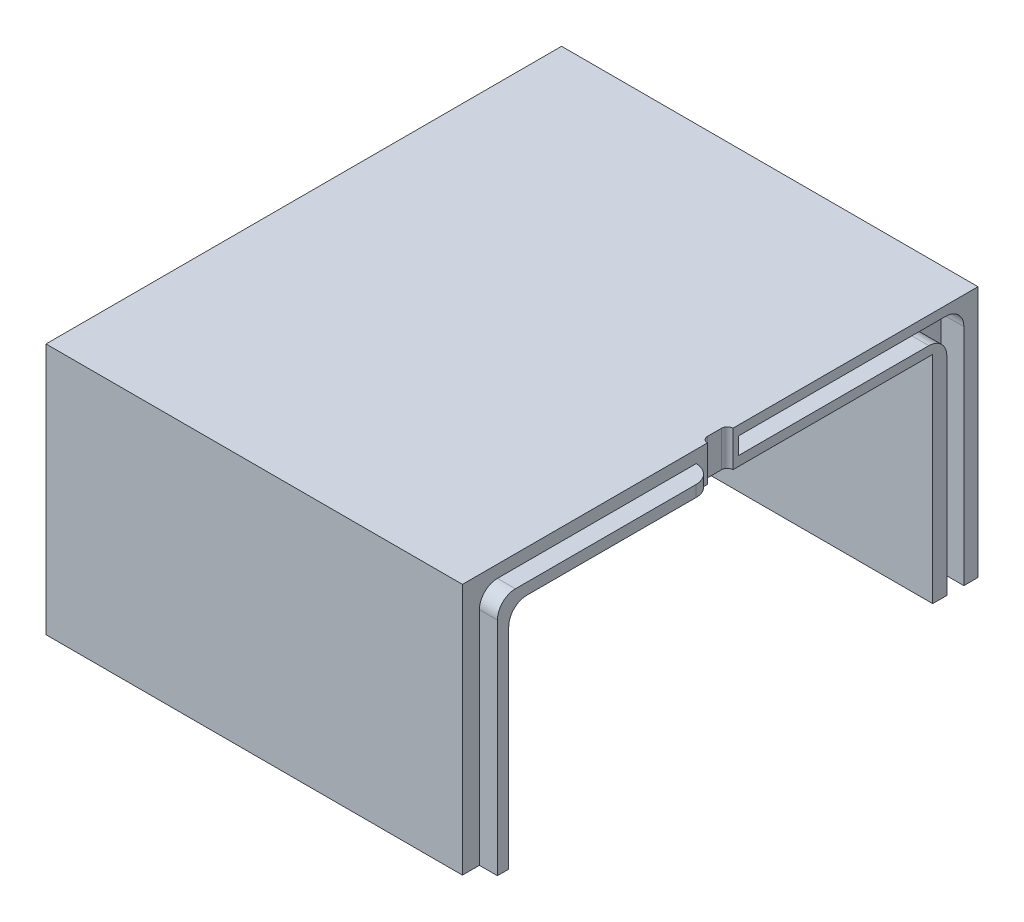
ISO-10303-21;
HEADER;
FILE_DESCRIPTION(('STEP AP214'),'2;1');
FILE_NAME('part.step','',(''),(''),'','','');
FILE_SCHEMA(('AUTOMOTIVE_DESIGN { 1 0 10303 214 1 1 1 1 }'));
ENDSEC;
DATA;
#1=APPLICATION_CONTEXT('core data for automotive mechanical design processes');
#2=APPLICATION_PROTOCOL_DEFINITION('international standard','automotive_design',2000,#1);
#3=PRODUCT_CONTEXT('',#1,'mechanical');
#4=PRODUCT('Part','Part','',(#3));
#5=PRODUCT_RELATED_PRODUCT_CATEGORY('part','',(#4));
#6=PRODUCT_DEFINITION_FORMATION('','',#4);
#7=PRODUCT_DEFINITION_CONTEXT('part definition',#1,'design');
#8=PRODUCT_DEFINITION('design','',#6,#7);
#9=PRODUCT_DEFINITION_SHAPE('','',#8);
#10=(LENGTH_UNIT() NAMED_UNIT(*) SI_UNIT(.MILLI.,.METRE.));
#11=(NAMED_UNIT(*) PLANE_ANGLE_UNIT() SI_UNIT($,.RADIAN.));
#12=(NAMED_UNIT(*) SI_UNIT($,.STERADIAN.) SOLID_ANGLE_UNIT());
#13=UNCERTAINTY_MEASURE_WITH_UNIT(LENGTH_MEASURE(1.E-05),#10,'distance_accuracy_value','');
#14=(GEOMETRIC_REPRESENTATION_CONTEXT(3) GLOBAL_UNCERTAINTY_ASSIGNED_CONTEXT((#13)) GLOBAL_UNIT_ASSIGNED_CONTEXT((#10,
#11,#12)) REPRESENTATION_CONTEXT('',''));
#15=CARTESIAN_POINT('',(0.,0.,0.));
#16=DIRECTION('',(0.,0.,1.));
#17=DIRECTION('',(1.,0.,0.));
#18=AXIS2_PLACEMENT_3D('',#15,#16,#17);
#19=CARTESIAN_POINT('',(0.,19.05,0.));
#20=DIRECTION('',(1.,0.,0.));
#21=DIRECTION('',(0.,0.,-1.));
#22=AXIS2_PLACEMENT_3D('',#19,#20,#21);
#23=PLANE('',#22);
#24=DIRECTION('',(0.,-1.,0.));
#25=VECTOR('',#24,1.);
#26=CARTESIAN_POINT('',(0.,0.,2.75));
#27=LINE('',#26,#25);
#28=CARTESIAN_POINT('',(0.,18.3,2.75));
#29=VERTEX_POINT('',#28);
#30=CARTESIAN_POINT('',(0.,0.,2.75));
#31=VERTEX_POINT('',#30);
#32=EDGE_CURVE('E528',#29,#31,#27,.T.);
#33=ORIENTED_EDGE('',*,*,#32,.F.);
#34=CARTESIAN_POINT('',(0.,18.3,4.3375));
#35=DIRECTION('',(1.,0.,0.));
#36=DIRECTION('',(0.,0.,-1.));
#37=AXIS2_PLACEMENT_3D('',#34,#35,#36);
#38=CIRCLE('',#37,1.5875);
#39=CARTESIAN_POINT('',(0.,19.8875,4.3375));
#40=VERTEX_POINT('',#39);
#41=EDGE_CURVE('E427',#29,#40,#38,.T.);
#42=ORIENTED_EDGE('',*,*,#41,.T.);
#43=DIRECTION('',(0.,0.,-1.));
#44=VECTOR('',#43,1.);
#45=CARTESIAN_POINT('',(0.,19.8875,0.));
#46=LINE('',#45,#44);
#47=CARTESIAN_POINT('',(0.,19.8875,21.125));
#48=VERTEX_POINT('',#47);
#49=EDGE_CURVE('E531',#48,#40,#46,.T.);
#50=ORIENTED_EDGE('',*,*,#49,.F.);
#51=DIRECTION('',(0.,1.,0.));
#52=VECTOR('',#51,1.);
#53=CARTESIAN_POINT('',(0.,0.,21.125));
#54=LINE('',#53,#52);
#55=CARTESIAN_POINT('',(0.,21.3875,21.125));
#56=VERTEX_POINT('',#55);
#57=EDGE_CURVE('E536',#48,#56,#54,.T.);
#58=ORIENTED_EDGE('',*,*,#57,.T.);
#59=DIRECTION('',(0.,0.,-1.));
#60=VECTOR('',#59,1.);
#61=CARTESIAN_POINT('',(0.,21.3875,0.));
#62=LINE('',#61,#60);
#63=CARTESIAN_POINT('',(0.,21.3875,2.8375));
#64=VERTEX_POINT('',#63);
#65=EDGE_CURVE('E527',#56,#64,#62,.T.);
#66=ORIENTED_EDGE('',*,*,#65,.T.);
#67=CARTESIAN_POINT('',(0.,19.8,2.8375));
#68=DIRECTION('',(1.,0.,0.));
#69=DIRECTION('',(0.,0.,-1.));
#70=AXIS2_PLACEMENT_3D('',#67,#68,#69);
#71=CIRCLE('',#70,1.5875);
#72=CARTESIAN_POINT('',(0.,19.8,1.25));
#73=VERTEX_POINT('',#72);
#74=EDGE_CURVE('E454',#64,#73,#71,.F.);
#75=ORIENTED_EDGE('',*,*,#74,.T.);
#76=DIRECTION('',(0.,-1.,0.));
#77=VECTOR('',#76,1.);
#78=CARTESIAN_POINT('',(0.,0.,1.25));
#79=LINE('',#78,#77);
#80=CARTESIAN_POINT('',(0.,0.,1.25));
#81=VERTEX_POINT('',#80);
#82=EDGE_CURVE('E525',#73,#81,#79,.T.);
#83=ORIENTED_EDGE('',*,*,#82,.T.);
#84=DIRECTION('',(0.,0.,1.));
#85=VECTOR('',#84,1.);
#86=CARTESIAN_POINT('',(0.,0.,0.));
#87=LINE('',#86,#85);
#88=CARTESIAN_POINT('',(0.,0.,0.));
#89=VERTEX_POINT('',#88);
#90=EDGE_CURVE('E266',#89,#81,#87,.T.);
#91=ORIENTED_EDGE('',*,*,#90,.F.);
#92=DIRECTION('',(0.,-1.,0.));
#93=VECTOR('',#92,1.);
#94=CARTESIAN_POINT('',(0.,19.05,0.));
#95=LINE('',#94,#93);
#96=CARTESIAN_POINT('',(0.,22.225,0.));
#97=VERTEX_POINT('',#96);
#98=EDGE_CURVE('E405',#97,#89,#95,.T.);
#99=ORIENTED_EDGE('',*,*,#98,.F.);
#100=DIRECTION('',(0.,0.,-1.));
#101=VECTOR('',#100,1.);
#102=CARTESIAN_POINT('',(0.,22.225,0.));
#103=LINE('',#102,#101);
#104=CARTESIAN_POINT('',(0.,22.225,21.625));
#105=VERTEX_POINT('',#104);
#106=EDGE_CURVE('E321',#105,#97,#103,.T.);
#107=ORIENTED_EDGE('',*,*,#106,.F.);
#108=DIRECTION('',(0.,-1.,0.));
#109=VECTOR('',#108,1.);
#110=CARTESIAN_POINT('',(0.,22.225,21.625));
#111=LINE('',#110,#109);
#112=CARTESIAN_POINT('',(0.,19.05,21.625));
#113=VERTEX_POINT('',#112);
#114=EDGE_CURVE('E344',#105,#113,#111,.T.);
#115=ORIENTED_EDGE('',*,*,#114,.T.);
#116=DIRECTION('',(0.,0.,-1.));
#117=VECTOR('',#116,1.);
#118=CARTESIAN_POINT('',(0.,19.05,0.));
#119=LINE('',#118,#117);
#120=CARTESIAN_POINT('',(0.,19.05,4.));
#121=VERTEX_POINT('',#120);
#122=EDGE_CURVE('E320',#113,#121,#119,.T.);
#123=ORIENTED_EDGE('',*,*,#122,.T.);
#124=DIRECTION('',(0.,-1.,0.));
#125=VECTOR('',#124,1.);
#126=CARTESIAN_POINT('',(0.,19.05,4.));
#127=LINE('',#126,#125);
#128=CARTESIAN_POINT('',(0.,0.,4.));
#129=VERTEX_POINT('',#128);
#130=EDGE_CURVE('E407',#121,#129,#127,.T.);
#131=ORIENTED_EDGE('',*,*,#130,.T.);
#132=EDGE_CURVE('E385',#31,#129,#87,.T.);
#133=ORIENTED_EDGE('',*,*,#132,.F.);
#134=EDGE_LOOP('',(#33,#42,#50,#58,#66,#75,#83,#91,#99,#107,#115,#123,#131,#133));
#135=FACE_BOUND('',#134,.T.);
#136=ADVANCED_FACE('F43',(#135),#23,.T.);
#137=CARTESIAN_POINT('',(0.,0.,0.));
#138=DIRECTION('',(0.,1.,0.));
#139=DIRECTION('',(0.,0.,1.));
#140=AXIS2_PLACEMENT_3D('',#137,#138,#139);
#141=PLANE('',#140);
#142=CARTESIAN_POINT('',(-18.375,0.,2.5));
#143=DIRECTION('',(0.,-1.,0.));
#144=DIRECTION('',(0.,0.,-1.));
#145=AXIS2_PLACEMENT_3D('',#142,#143,#144);
#146=CIRCLE('',#145,0.88899999999999);
#147=CARTESIAN_POINT('',(-18.375,0.,1.61100000000001));
#148=VERTEX_POINT('',#147);
#149=EDGE_CURVE('E314',#148,#148,#146,.T.);
#150=ORIENTED_EDGE('',*,*,#149,.F.);
#151=EDGE_LOOP('',(#150));
#152=FACE_BOUND('',#151,.T.);
#153=CARTESIAN_POINT('',(-18.375,0.,43.));
#154=DIRECTION('',(0.,-1.,0.));
#155=DIRECTION('',(0.,0.,-1.));
#156=AXIS2_PLACEMENT_3D('',#153,#154,#155);
#157=CIRCLE('',#156,0.88899999999999);
#158=CARTESIAN_POINT('',(-18.375,0.,42.111));
#159=VERTEX_POINT('',#158);
#160=EDGE_CURVE('E308',#159,#159,#157,.T.);
#161=ORIENTED_EDGE('',*,*,#160,.F.);
#162=EDGE_LOOP('',(#161));
#163=FACE_BOUND('',#162,.T.);
#164=DIRECTION('',(1.,0.,0.));
#165=VECTOR('',#164,1.);
#166=CARTESIAN_POINT('',(-2.,0.,1.25));
#167=LINE('',#166,#165);
#168=CARTESIAN_POINT('',(-2.,0.,1.25));
#169=VERTEX_POINT('',#168);
#170=EDGE_CURVE('E246',#169,#81,#167,.T.);
#171=ORIENTED_EDGE('',*,*,#170,.F.);
#172=DIRECTION('',(0.,0.,-1.));
#173=VECTOR('',#172,1.);
#174=CARTESIAN_POINT('',(-2.,0.,0.));
#175=LINE('',#174,#173);
#176=CARTESIAN_POINT('',(-2.,0.,2.75));
#177=VERTEX_POINT('',#176);
#178=EDGE_CURVE('E253',#177,#169,#175,.T.);
#179=ORIENTED_EDGE('',*,*,#178,.F.);
#180=DIRECTION('',(1.,0.,0.));
#181=VECTOR('',#180,1.);
#182=CARTESIAN_POINT('',(-2.,0.,2.75));
#183=LINE('',#182,#181);
#184=EDGE_CURVE('E268',#177,#31,#183,.T.);
#185=ORIENTED_EDGE('',*,*,#184,.T.);
#186=ORIENTED_EDGE('',*,*,#132,.T.);
#187=DIRECTION('',(-1.,0.,0.));
#188=VECTOR('',#187,1.);
#189=CARTESIAN_POINT('',(0.,0.,4.));
#190=LINE('',#189,#188);
#191=CARTESIAN_POINT('',(-32.75,0.,4.));
#192=VERTEX_POINT('',#191);
#193=EDGE_CURVE('E382',#129,#192,#190,.T.);
#194=ORIENTED_EDGE('',*,*,#193,.T.);
#195=DIRECTION('',(0.,0.,1.));
#196=VECTOR('',#195,1.);
#197=CARTESIAN_POINT('',(-32.75,0.,0.));
#198=LINE('',#197,#196);
#199=CARTESIAN_POINT('',(-32.75,0.,41.5));
#200=VERTEX_POINT('',#199);
#201=EDGE_CURVE('E379',#192,#200,#198,.T.);
#202=ORIENTED_EDGE('',*,*,#201,.T.);
#203=DIRECTION('',(1.,0.,0.));
#204=VECTOR('',#203,1.);
#205=CARTESIAN_POINT('',(0.,0.,41.5));
#206=LINE('',#205,#204);
#207=CARTESIAN_POINT('',(0.,0.,41.5));
#208=VERTEX_POINT('',#207);
#209=EDGE_CURVE('E365',#200,#208,#206,.T.);
#210=ORIENTED_EDGE('',*,*,#209,.T.);
#211=CARTESIAN_POINT('',(0.,0.,43.));
#212=VERTEX_POINT('',#211);
#213=EDGE_CURVE('E370',#208,#212,#87,.T.);
#214=ORIENTED_EDGE('',*,*,#213,.T.);
#215=DIRECTION('',(-1.,0.,0.));
#216=VECTOR('',#215,1.);
#217=CARTESIAN_POINT('',(1.5875,0.,43.));
#218=LINE('',#217,#216);
#219=CARTESIAN_POINT('',(1.5875,0.,43.));
#220=VERTEX_POINT('',#219);
#221=EDGE_CURVE('E290',#220,#212,#218,.T.);
#222=ORIENTED_EDGE('',*,*,#221,.F.);
#223=DIRECTION('',(0.,0.,-1.));
#224=VECTOR('',#223,1.);
#225=CARTESIAN_POINT('',(1.5875,0.,0.));
#226=LINE('',#225,#224);
#227=CARTESIAN_POINT('',(1.5875,0.,44.));
#228=VERTEX_POINT('',#227);
#229=EDGE_CURVE('E283',#228,#220,#226,.T.);
#230=ORIENTED_EDGE('',*,*,#229,.F.);
#231=DIRECTION('',(-1.,0.,0.));
#232=VECTOR('',#231,1.);
#233=CARTESIAN_POINT('',(1.5875,0.,44.));
#234=LINE('',#233,#232);
#235=CARTESIAN_POINT('',(0.,0.,44.));
#236=VERTEX_POINT('',#235);
#237=EDGE_CURVE('E305',#228,#236,#234,.T.);
#238=ORIENTED_EDGE('',*,*,#237,.T.);
#239=CARTESIAN_POINT('',(0.,0.,45.5));
#240=VERTEX_POINT('',#239);
#241=EDGE_CURVE('E395',#236,#240,#87,.T.);
#242=ORIENTED_EDGE('',*,*,#241,.T.);
#243=DIRECTION('',(-1.,0.,0.));
#244=VECTOR('',#243,1.);
#245=CARTESIAN_POINT('',(0.,0.,45.5));
#246=LINE('',#245,#244);
#247=CARTESIAN_POINT('',(-36.75,0.,45.5));
#248=VERTEX_POINT('',#247);
#249=EDGE_CURVE('E392',#240,#248,#246,.T.);
#250=ORIENTED_EDGE('',*,*,#249,.T.);
#251=DIRECTION('',(0.,0.,1.));
#252=VECTOR('',#251,1.);
#253=CARTESIAN_POINT('',(-36.75,0.,0.));
#254=LINE('',#253,#252);
#255=CARTESIAN_POINT('',(-36.75,0.,0.));
#256=VERTEX_POINT('',#255);
#257=EDGE_CURVE('E389',#256,#248,#254,.T.);
#258=ORIENTED_EDGE('',*,*,#257,.F.);
#259=DIRECTION('',(-1.,0.,0.));
#260=VECTOR('',#259,1.);
#261=CARTESIAN_POINT('',(0.,0.,0.));
#262=LINE('',#261,#260);
#263=EDGE_CURVE('E387',#89,#256,#262,.T.);
#264=ORIENTED_EDGE('',*,*,#263,.F.);
#265=ORIENTED_EDGE('',*,*,#90,.T.);
#266=EDGE_LOOP('',(#171,#179,#185,#186,#194,#202,#210,#214,#222,#230,#238,#242,#250,#258,#264,#265));
#267=FACE_BOUND('',#266,.T.);
#268=ADVANCED_FACE('F263',(#152,#163,#267),#141,.F.);
#269=CARTESIAN_POINT('',(0.,19.05,41.5));
#270=DIRECTION('',(0.,0.,-1.));
#271=DIRECTION('',(-1.,0.,0.));
#272=AXIS2_PLACEMENT_3D('',#269,#270,#271);
#273=PLANE('',#272);
#274=ORIENTED_EDGE('',*,*,#209,.F.);
#275=DIRECTION('',(0.,-1.,0.));
#276=VECTOR('',#275,1.);
#277=CARTESIAN_POINT('',(-32.75,19.05,41.5));
#278=LINE('',#277,#276);
#279=CARTESIAN_POINT('',(-32.75,19.05,41.5));
#280=VERTEX_POINT('',#279);
#281=EDGE_CURVE('E412',#280,#200,#278,.T.);
#282=ORIENTED_EDGE('',*,*,#281,.F.);
#283=DIRECTION('',(1.,0.,0.));
#284=VECTOR('',#283,1.);
#285=CARTESIAN_POINT('',(0.,19.05,41.5));
#286=LINE('',#285,#284);
#287=CARTESIAN_POINT('',(0.,19.05,41.5));
#288=VERTEX_POINT('',#287);
#289=EDGE_CURVE('E366',#280,#288,#286,.T.);
#290=ORIENTED_EDGE('',*,*,#289,.T.);
#291=DIRECTION('',(0.,-1.,0.));
#292=VECTOR('',#291,1.);
#293=CARTESIAN_POINT('',(0.,19.05,41.5));
#294=LINE('',#293,#292);
#295=EDGE_CURVE('E376',#288,#208,#294,.T.);
#296=ORIENTED_EDGE('',*,*,#295,.T.);
#297=EDGE_LOOP('',(#274,#282,#290,#296));
#298=FACE_BOUND('',#297,.T.);
#299=ADVANCED_FACE('F495',(#298),#273,.T.);
#300=CARTESIAN_POINT('',(-32.75,19.05,0.));
#301=DIRECTION('',(1.,0.,0.));
#302=DIRECTION('',(0.,0.,-1.));
#303=AXIS2_PLACEMENT_3D('',#300,#301,#302);
#304=PLANE('',#303);
#305=ORIENTED_EDGE('',*,*,#201,.F.);
#306=DIRECTION('',(0.,-1.,0.));
#307=VECTOR('',#306,1.);
#308=CARTESIAN_POINT('',(-32.75,19.05,4.));
#309=LINE('',#308,#307);
#310=CARTESIAN_POINT('',(-32.75,19.05,4.));
#311=VERTEX_POINT('',#310);
#312=EDGE_CURVE('E410',#311,#192,#309,.T.);
#313=ORIENTED_EDGE('',*,*,#312,.F.);
#314=DIRECTION('',(0.,0.,1.));
#315=VECTOR('',#314,1.);
#316=CARTESIAN_POINT('',(-32.75,19.05,0.));
#317=LINE('',#316,#315);
#318=EDGE_CURVE('E369',#311,#280,#317,.T.);
#319=ORIENTED_EDGE('',*,*,#318,.T.);
#320=ORIENTED_EDGE('',*,*,#281,.T.);
#321=EDGE_LOOP('',(#305,#313,#319,#320));
#322=FACE_BOUND('',#321,.T.);
#323=ADVANCED_FACE('F492',(#322),#304,.T.);
#324=CARTESIAN_POINT('',(0.,19.05,4.));
#325=DIRECTION('',(0.,0.,1.));
#326=DIRECTION('',(1.,0.,0.));
#327=AXIS2_PLACEMENT_3D('',#324,#325,#326);
#328=PLANE('',#327);
#329=ORIENTED_EDGE('',*,*,#193,.F.);
#330=ORIENTED_EDGE('',*,*,#130,.F.);
#331=DIRECTION('',(-1.,0.,0.));
#332=VECTOR('',#331,1.);
#333=CARTESIAN_POINT('',(0.,19.05,4.));
#334=LINE('',#333,#332);
#335=EDGE_CURVE('E373',#121,#311,#334,.T.);
#336=ORIENTED_EDGE('',*,*,#335,.T.);
#337=ORIENTED_EDGE('',*,*,#312,.T.);
#338=EDGE_LOOP('',(#329,#330,#336,#337));
#339=FACE_BOUND('',#338,.T.);
#340=ADVANCED_FACE('F488',(#339),#328,.T.);
#341=CARTESIAN_POINT('',(0.,19.05,0.));
#342=DIRECTION('',(0.,0.,1.));
#343=DIRECTION('',(1.,0.,0.));
#344=AXIS2_PLACEMENT_3D('',#341,#342,#343);
#345=PLANE('',#344);
#346=ORIENTED_EDGE('',*,*,#263,.T.);
#347=DIRECTION('',(0.,-1.,0.));
#348=VECTOR('',#347,1.);
#349=CARTESIAN_POINT('',(-36.75,19.05,0.));
#350=LINE('',#349,#348);
#351=CARTESIAN_POINT('',(-36.75,22.225,0.));
#352=VERTEX_POINT('',#351);
#353=EDGE_CURVE('E402',#352,#256,#350,.T.);
#354=ORIENTED_EDGE('',*,*,#353,.F.);
#355=DIRECTION('',(1.,0.,0.));
#356=VECTOR('',#355,1.);
#357=CARTESIAN_POINT('',(0.,22.225,0.));
#358=LINE('',#357,#356);
#359=EDGE_CURVE('E324',#352,#97,#358,.T.);
#360=ORIENTED_EDGE('',*,*,#359,.T.);
#361=ORIENTED_EDGE('',*,*,#98,.T.);
#362=EDGE_LOOP('',(#346,#354,#360,#361));
#363=FACE_BOUND('',#362,.T.);
#364=ADVANCED_FACE('F523',(#363),#345,.F.);
#365=CARTESIAN_POINT('',(-36.75,19.05,0.));
#366=DIRECTION('',(1.,0.,0.));
#367=DIRECTION('',(0.,0.,-1.));
#368=AXIS2_PLACEMENT_3D('',#365,#366,#367);
#369=PLANE('',#368);
#370=ORIENTED_EDGE('',*,*,#257,.T.);
#371=DIRECTION('',(0.,-1.,0.));
#372=VECTOR('',#371,1.);
#373=CARTESIAN_POINT('',(-36.75,19.05,45.5));
#374=LINE('',#373,#372);
#375=CARTESIAN_POINT('',(-36.75,22.225,45.5));
#376=VERTEX_POINT('',#375);
#377=EDGE_CURVE('E400',#376,#248,#374,.T.);
#378=ORIENTED_EDGE('',*,*,#377,.F.);
#379=DIRECTION('',(0.,0.,-1.));
#380=VECTOR('',#379,1.);
#381=CARTESIAN_POINT('',(-36.75,22.225,0.));
#382=LINE('',#381,#380);
#383=EDGE_CURVE('E328',#376,#352,#382,.T.);
#384=ORIENTED_EDGE('',*,*,#383,.T.);
#385=ORIENTED_EDGE('',*,*,#353,.T.);
#386=EDGE_LOOP('',(#370,#378,#384,#385));
#387=FACE_BOUND('',#386,.T.);
#388=ADVANCED_FACE('F520',(#387),#369,.F.);
#389=CARTESIAN_POINT('',(0.,19.05,45.5));
#390=DIRECTION('',(0.,0.,1.));
#391=DIRECTION('',(1.,0.,0.));
#392=AXIS2_PLACEMENT_3D('',#389,#390,#391);
#393=PLANE('',#392);
#394=ORIENTED_EDGE('',*,*,#249,.F.);
#395=DIRECTION('',(0.,-1.,0.));
#396=VECTOR('',#395,1.);
#397=CARTESIAN_POINT('',(0.,19.05,45.5));
#398=LINE('',#397,#396);
#399=CARTESIAN_POINT('',(0.,22.225,45.5));
#400=VERTEX_POINT('',#399);
#401=EDGE_CURVE('E397',#400,#240,#398,.T.);
#402=ORIENTED_EDGE('',*,*,#401,.F.);
#403=DIRECTION('',(1.,0.,0.));
#404=VECTOR('',#403,1.);
#405=CARTESIAN_POINT('',(0.,22.225,45.5));
#406=LINE('',#405,#404);
#407=EDGE_CURVE('E331',#376,#400,#406,.T.);
#408=ORIENTED_EDGE('',*,*,#407,.F.);
#409=ORIENTED_EDGE('',*,*,#377,.T.);
#410=EDGE_LOOP('',(#394,#402,#408,#409));
#411=FACE_BOUND('',#410,.T.);
#412=ADVANCED_FACE('F517',(#411),#393,.T.);
#413=DIRECTION('',(0.,0.,-1.));
#414=VECTOR('',#413,1.);
#415=CARTESIAN_POINT('',(0.,20.1375,0.));
#416=LINE('',#415,#414);
#417=CARTESIAN_POINT('',(0.,20.1375,41.4125));
#418=VERTEX_POINT('',#417);
#419=CARTESIAN_POINT('',(0.,20.1375,24.875));
#420=VERTEX_POINT('',#419);
#421=EDGE_CURVE('E280',#418,#420,#416,.T.);
#422=ORIENTED_EDGE('',*,*,#421,.F.);
#423=CARTESIAN_POINT('',(0.,18.55,41.4125));
#424=DIRECTION('',(1.,0.,0.));
#425=DIRECTION('',(0.,0.,-1.));
#426=AXIS2_PLACEMENT_3D('',#423,#424,#425);
#427=CIRCLE('',#426,1.5875);
#428=CARTESIAN_POINT('',(0.,18.55,43.));
#429=VERTEX_POINT('',#428);
#430=EDGE_CURVE('E441',#418,#429,#427,.T.);
#431=ORIENTED_EDGE('',*,*,#430,.T.);
#432=DIRECTION('',(0.,1.,0.));
#433=VECTOR('',#432,1.);
#434=CARTESIAN_POINT('',(0.,0.,43.));
#435=LINE('',#434,#433);
#436=EDGE_CURVE('E299',#212,#429,#435,.T.);
#437=ORIENTED_EDGE('',*,*,#436,.F.);
#438=ORIENTED_EDGE('',*,*,#213,.F.);
#439=ORIENTED_EDGE('',*,*,#295,.F.);
#440=DIRECTION('',(0.,0.,-1.));
#441=VECTOR('',#440,1.);
#442=CARTESIAN_POINT('',(0.,19.05,0.));
#443=LINE('',#442,#441);
#444=CARTESIAN_POINT('',(0.,19.05,23.875));
#445=VERTEX_POINT('',#444);
#446=EDGE_CURVE('E347',#288,#445,#443,.T.);
#447=ORIENTED_EDGE('',*,*,#446,.T.);
#448=DIRECTION('',(0.,-1.,0.));
#449=VECTOR('',#448,1.);
#450=CARTESIAN_POINT('',(0.,22.225,23.875));
#451=LINE('',#450,#449);
#452=CARTESIAN_POINT('',(0.,22.225,23.875));
#453=VERTEX_POINT('',#452);
#454=EDGE_CURVE('E362',#453,#445,#451,.T.);
#455=ORIENTED_EDGE('',*,*,#454,.F.);
#456=DIRECTION('',(0.,0.,-1.));
#457=VECTOR('',#456,1.);
#458=CARTESIAN_POINT('',(0.,22.225,0.));
#459=LINE('',#458,#457);
#460=EDGE_CURVE('E334',#400,#453,#459,.T.);
#461=ORIENTED_EDGE('',*,*,#460,.F.);
#462=ORIENTED_EDGE('',*,*,#401,.T.);
#463=ORIENTED_EDGE('',*,*,#241,.F.);
#464=DIRECTION('',(0.,1.,0.));
#465=VECTOR('',#464,1.);
#466=CARTESIAN_POINT('',(0.,0.,44.));
#467=LINE('',#466,#465);
#468=CARTESIAN_POINT('',(0.,19.55,44.));
#469=VERTEX_POINT('',#468);
#470=EDGE_CURVE('E296',#236,#469,#467,.T.);
#471=ORIENTED_EDGE('',*,*,#470,.T.);
#472=CARTESIAN_POINT('',(0.,19.55,42.4125));
#473=DIRECTION('',(1.,0.,0.));
#474=DIRECTION('',(0.,0.,-1.));
#475=AXIS2_PLACEMENT_3D('',#472,#473,#474);
#476=CIRCLE('',#475,1.5875);
#477=CARTESIAN_POINT('',(0.,21.1375,42.4125));
#478=VERTEX_POINT('',#477);
#479=EDGE_CURVE('E11',#469,#478,#476,.F.);
#480=ORIENTED_EDGE('',*,*,#479,.T.);
#481=DIRECTION('',(0.,0.,-1.));
#482=VECTOR('',#481,1.);
#483=CARTESIAN_POINT('',(0.,21.1375,0.));
#484=LINE('',#483,#482);
#485=CARTESIAN_POINT('',(0.,21.1375,24.875));
#486=VERTEX_POINT('',#485);
#487=EDGE_CURVE('E293',#478,#486,#484,.T.);
#488=ORIENTED_EDGE('',*,*,#487,.T.);
#489=DIRECTION('',(0.,-1.,0.));
#490=VECTOR('',#489,1.);
#491=CARTESIAN_POINT('',(0.,0.,24.875));
#492=LINE('',#491,#490);
#493=EDGE_CURVE('E270',#486,#420,#492,.T.);
#494=ORIENTED_EDGE('',*,*,#493,.T.);
#495=EDGE_LOOP('',(#422,#431,#437,#438,#439,#447,#455,#461,#462,#463,#471,#480,#488,#494));
#496=FACE_BOUND('',#495,.T.);
#497=ADVANCED_FACE('F470',(#496),#23,.T.);
#498=CARTESIAN_POINT('',(0.,22.225,23.375));
#499=DIRECTION('',(0.,-1.,0.));
#500=DIRECTION('',(0.,0.,-1.));
#501=AXIS2_PLACEMENT_3D('',#498,#499,#500);
#502=CYLINDRICAL_SURFACE('',#501,0.499999999999994);
#503=CARTESIAN_POINT('',(0.,19.05,23.375));
#504=DIRECTION('',(0.,1.,0.));
#505=DIRECTION('',(0.,0.,1.));
#506=AXIS2_PLACEMENT_3D('',#503,#504,#505);
#507=CIRCLE('',#506,0.499999999999994);
#508=CARTESIAN_POINT('',(-0.499999999999991,19.05,23.375));
#509=VERTEX_POINT('',#508);
#510=EDGE_CURVE('E349',#509,#445,#507,.T.);
#511=ORIENTED_EDGE('',*,*,#510,.F.);
#512=DIRECTION('',(0.,-1.,0.));
#513=VECTOR('',#512,1.);
#514=CARTESIAN_POINT('',(-0.499999999999991,22.225,23.375));
#515=LINE('',#514,#513);
#516=CARTESIAN_POINT('',(-0.499999999999991,22.225,23.375));
#517=VERTEX_POINT('',#516);
#518=EDGE_CURVE('E360',#517,#509,#515,.T.);
#519=ORIENTED_EDGE('',*,*,#518,.F.);
#520=CARTESIAN_POINT('',(0.,22.225,23.375));
#521=DIRECTION('',(0.,1.,0.));
#522=DIRECTION('',(0.,0.,1.));
#523=AXIS2_PLACEMENT_3D('',#520,#521,#522);
#524=CIRCLE('',#523,0.499999999999994);
#525=EDGE_CURVE('E336',#517,#453,#524,.T.);
#526=ORIENTED_EDGE('',*,*,#525,.T.);
#527=ORIENTED_EDGE('',*,*,#454,.T.);
#528=EDGE_LOOP('',(#511,#519,#526,#527));
#529=FACE_BOUND('',#528,.T.);
#530=ADVANCED_FACE('F501',(#529),#502,.F.);
#531=CARTESIAN_POINT('',(-0.499999999999993,22.225,0.));
#532=DIRECTION('',(-1.,0.,0.));
#533=DIRECTION('',(0.,0.,1.));
#534=AXIS2_PLACEMENT_3D('',#531,#532,#533);
#535=PLANE('',#534);
#536=DIRECTION('',(0.,0.,-1.));
#537=VECTOR('',#536,1.);
#538=CARTESIAN_POINT('',(-0.499999999999993,19.05,0.));
#539=LINE('',#538,#537);
#540=CARTESIAN_POINT('',(-0.499999999999997,19.05,22.125));
#541=VERTEX_POINT('',#540);
#542=EDGE_CURVE('E352',#509,#541,#539,.T.);
#543=ORIENTED_EDGE('',*,*,#542,.T.);
#544=DIRECTION('',(0.,-1.,0.));
#545=VECTOR('',#544,1.);
#546=CARTESIAN_POINT('',(-0.499999999999997,22.225,22.125));
#547=LINE('',#546,#545);
#548=CARTESIAN_POINT('',(-0.499999999999997,22.225,22.125));
#549=VERTEX_POINT('',#548);
#550=EDGE_CURVE('E358',#549,#541,#547,.T.);
#551=ORIENTED_EDGE('',*,*,#550,.F.);
#552=DIRECTION('',(0.,0.,-1.));
#553=VECTOR('',#552,1.);
#554=CARTESIAN_POINT('',(-0.499999999999993,22.225,0.));
#555=LINE('',#554,#553);
#556=EDGE_CURVE('E339',#517,#549,#555,.T.);
#557=ORIENTED_EDGE('',*,*,#556,.F.);
#558=ORIENTED_EDGE('',*,*,#518,.T.);
#559=EDGE_LOOP('',(#543,#551,#557,#558));
#560=FACE_BOUND('',#559,.T.);
#561=ADVANCED_FACE('F508',(#560),#535,.F.);
#562=CARTESIAN_POINT('',(0.,22.225,22.125));
#563=DIRECTION('',(0.,-1.,0.));
#564=DIRECTION('',(0.,0.,-1.));
#565=AXIS2_PLACEMENT_3D('',#562,#563,#564);
#566=CYLINDRICAL_SURFACE('',#565,0.499999999999994);
#567=CARTESIAN_POINT('',(0.,19.05,22.125));
#568=DIRECTION('',(0.,1.,0.));
#569=DIRECTION('',(0.,0.,1.));
#570=AXIS2_PLACEMENT_3D('',#567,#568,#569);
#571=CIRCLE('',#570,0.499999999999994);
#572=EDGE_CURVE('E325',#113,#541,#571,.T.);
#573=ORIENTED_EDGE('',*,*,#572,.F.);
#574=ORIENTED_EDGE('',*,*,#114,.F.);
#575=CARTESIAN_POINT('',(0.,22.225,22.125));
#576=DIRECTION('',(0.,1.,0.));
#577=DIRECTION('',(0.,0.,1.));
#578=AXIS2_PLACEMENT_3D('',#575,#576,#577);
#579=CIRCLE('',#578,0.499999999999994);
#580=EDGE_CURVE('E341',#105,#549,#579,.T.);
#581=ORIENTED_EDGE('',*,*,#580,.T.);
#582=ORIENTED_EDGE('',*,*,#550,.T.);
#583=EDGE_LOOP('',(#573,#574,#581,#582));
#584=FACE_BOUND('',#583,.T.);
#585=ADVANCED_FACE('F656',(#584),#566,.F.);
#586=CARTESIAN_POINT('',(0.,22.225,23.375));
#587=DIRECTION('',(0.,1.,0.));
#588=DIRECTION('',(0.,0.,1.));
#589=AXIS2_PLACEMENT_3D('',#586,#587,#588);
#590=PLANE('',#589);
#591=ORIENTED_EDGE('',*,*,#106,.T.);
#592=ORIENTED_EDGE('',*,*,#359,.F.);
#593=ORIENTED_EDGE('',*,*,#383,.F.);
#594=ORIENTED_EDGE('',*,*,#407,.T.);
#595=ORIENTED_EDGE('',*,*,#460,.T.);
#596=ORIENTED_EDGE('',*,*,#525,.F.);
#597=ORIENTED_EDGE('',*,*,#556,.T.);
#598=ORIENTED_EDGE('',*,*,#580,.F.);
#599=EDGE_LOOP('',(#591,#592,#593,#594,#595,#596,#597,#598));
#600=FACE_BOUND('',#599,.T.);
#601=ADVANCED_FACE('F512',(#600),#590,.T.);
#602=CARTESIAN_POINT('',(0.,19.05,23.375));
#603=DIRECTION('',(0.,1.,0.));
#604=DIRECTION('',(0.,0.,1.));
#605=AXIS2_PLACEMENT_3D('',#602,#603,#604);
#606=PLANE('',#605);
#607=ORIENTED_EDGE('',*,*,#289,.F.);
#608=ORIENTED_EDGE('',*,*,#318,.F.);
#609=ORIENTED_EDGE('',*,*,#335,.F.);
#610=ORIENTED_EDGE('',*,*,#122,.F.);
#611=ORIENTED_EDGE('',*,*,#572,.T.);
#612=ORIENTED_EDGE('',*,*,#542,.F.);
#613=ORIENTED_EDGE('',*,*,#510,.T.);
#614=ORIENTED_EDGE('',*,*,#446,.F.);
#615=EDGE_LOOP('',(#607,#608,#609,#610,#611,#612,#613,#614));
#616=FACE_BOUND('',#615,.T.);
#617=ADVANCED_FACE('F504',(#616),#606,.F.);
#618=CARTESIAN_POINT('',(-18.375,5.73,2.5));
#619=DIRECTION('',(0.,-1.,0.));
#620=DIRECTION('',(0.,0.,-1.));
#621=AXIS2_PLACEMENT_3D('',#618,#619,#620);
#622=CONICAL_SURFACE('',#621,0.888999999999997,1.02974425867665);
#623=CARTESIAN_POINT('',(-18.375,6.2641650903155,2.5));
#624=VERTEX_POINT('',#623);
#625=VERTEX_LOOP('',#624);
#626=FACE_BOUND('',#625,.T.);
#627=CARTESIAN_POINT('',(-18.375,5.73,2.5));
#628=DIRECTION('',(0.,-1.,0.));
#629=DIRECTION('',(0.,0.,-1.));
#630=AXIS2_PLACEMENT_3D('',#627,#628,#629);
#631=CIRCLE('',#630,0.888999999999997);
#632=CARTESIAN_POINT('',(-18.375,5.73,1.61100000000001));
#633=VERTEX_POINT('',#632);
#634=EDGE_CURVE('E317',#633,#633,#631,.T.);
#635=ORIENTED_EDGE('',*,*,#634,.T.);
#636=EDGE_LOOP('',(#635));
#637=FACE_BOUND('',#636,.T.);
#638=ADVANCED_FACE('F649',(#626,#637),#622,.F.);
#639=CARTESIAN_POINT('',(-18.375,0.,2.5));
#640=DIRECTION('',(0.,-1.,0.));
#641=DIRECTION('',(0.,0.,-1.));
#642=AXIS2_PLACEMENT_3D('',#639,#640,#641);
#643=CYLINDRICAL_SURFACE('',#642,0.888999999999994);
#644=ORIENTED_EDGE('',*,*,#634,.F.);
#645=EDGE_LOOP('',(#644));
#646=FACE_BOUND('',#645,.T.);
#647=ORIENTED_EDGE('',*,*,#149,.T.);
#648=EDGE_LOOP('',(#647));
#649=FACE_BOUND('',#648,.T.);
#650=ADVANCED_FACE('F645',(#646,#649),#643,.F.);
#651=CARTESIAN_POINT('',(-18.375,5.73,43.));
#652=DIRECTION('',(0.,-1.,0.));
#653=DIRECTION('',(0.,0.,-1.));
#654=AXIS2_PLACEMENT_3D('',#651,#652,#653);
#655=CONICAL_SURFACE('',#654,0.888999999999997,1.02974425867665);
#656=CARTESIAN_POINT('',(-18.375,6.2641650903155,43.));
#657=VERTEX_POINT('',#656);
#658=VERTEX_LOOP('',#657);
#659=FACE_BOUND('',#658,.T.);
#660=CARTESIAN_POINT('',(-18.375,5.73,43.));
#661=DIRECTION('',(0.,-1.,0.));
#662=DIRECTION('',(0.,0.,-1.));
#663=AXIS2_PLACEMENT_3D('',#660,#661,#662);
#664=CIRCLE('',#663,0.888999999999997);
#665=CARTESIAN_POINT('',(-18.375,5.73,42.111));
#666=VERTEX_POINT('',#665);
#667=EDGE_CURVE('E311',#666,#666,#664,.T.);
#668=ORIENTED_EDGE('',*,*,#667,.T.);
#669=EDGE_LOOP('',(#668));
#670=FACE_BOUND('',#669,.T.);
#671=ADVANCED_FACE('F641',(#659,#670),#655,.F.);
#672=CARTESIAN_POINT('',(-18.375,0.,43.));
#673=DIRECTION('',(0.,-1.,0.));
#674=DIRECTION('',(0.,0.,-1.));
#675=AXIS2_PLACEMENT_3D('',#672,#673,#674);
#676=CYLINDRICAL_SURFACE('',#675,0.888999999999994);
#677=ORIENTED_EDGE('',*,*,#667,.F.);
#678=EDGE_LOOP('',(#677));
#679=FACE_BOUND('',#678,.T.);
#680=ORIENTED_EDGE('',*,*,#160,.T.);
#681=EDGE_LOOP('',(#680));
#682=FACE_BOUND('',#681,.T.);
#683=ADVANCED_FACE('F638',(#679,#682),#676,.F.);
#684=CARTESIAN_POINT('',(1.5875,21.1375,0.));
#685=DIRECTION('',(0.,1.,0.));
#686=DIRECTION('',(0.,0.,1.));
#687=AXIS2_PLACEMENT_3D('',#684,#685,#686);
#688=PLANE('',#687);
#689=ORIENTED_EDGE('',*,*,#487,.F.);
#690=DIRECTION('',(-1.,0.,0.));
#691=VECTOR('',#690,1.);
#692=CARTESIAN_POINT('',(1.5875,21.1375,42.4125));
#693=LINE('',#692,#691);
#694=CARTESIAN_POINT('',(1.5875,21.1375,42.4125));
#695=VERTEX_POINT('',#694);
#696=EDGE_CURVE('E65',#478,#695,#693,.F.);
#697=ORIENTED_EDGE('',*,*,#696,.T.);
#698=DIRECTION('',(0.,0.,-1.));
#699=VECTOR('',#698,1.);
#700=CARTESIAN_POINT('',(1.5875,21.1375,0.));
#701=LINE('',#700,#699);
#702=CARTESIAN_POINT('',(1.5875,21.1375,26.4625));
#703=VERTEX_POINT('',#702);
#704=EDGE_CURVE('E277',#695,#703,#701,.T.);
#705=ORIENTED_EDGE('',*,*,#704,.T.);
#706=CARTESIAN_POINT('',(0.,21.1375,26.4625));
#707=DIRECTION('',(0.,1.,0.));
#708=DIRECTION('',(0.,0.,1.));
#709=AXIS2_PLACEMENT_3D('',#706,#707,#708);
#710=CIRCLE('',#709,1.5875);
#711=EDGE_CURVE('E448',#703,#486,#710,.T.);
#712=ORIENTED_EDGE('',*,*,#711,.T.);
#713=EDGE_LOOP('',(#689,#697,#705,#712));
#714=FACE_BOUND('',#713,.T.);
#715=ADVANCED_FACE('F634',(#714),#688,.T.);
#716=CARTESIAN_POINT('',(1.5875,0.,44.));
#717=DIRECTION('',(0.,0.,1.));
#718=DIRECTION('',(1.,0.,0.));
#719=AXIS2_PLACEMENT_3D('',#716,#717,#718);
#720=PLANE('',#719);
#721=DIRECTION('',(0.,1.,0.));
#722=VECTOR('',#721,1.);
#723=CARTESIAN_POINT('',(1.5875,0.,44.));
#724=LINE('',#723,#722);
#725=CARTESIAN_POINT('',(1.5875,19.55,44.));
#726=VERTEX_POINT('',#725);
#727=EDGE_CURVE('E279',#228,#726,#724,.T.);
#728=ORIENTED_EDGE('',*,*,#727,.T.);
#729=DIRECTION('',(-1.,0.,0.));
#730=VECTOR('',#729,1.);
#731=CARTESIAN_POINT('',(1.5875,19.55,44.));
#732=LINE('',#731,#730);
#733=EDGE_CURVE('E445',#726,#469,#732,.T.);
#734=ORIENTED_EDGE('',*,*,#733,.T.);
#735=ORIENTED_EDGE('',*,*,#470,.F.);
#736=ORIENTED_EDGE('',*,*,#237,.F.);
#737=EDGE_LOOP('',(#728,#734,#735,#736));
#738=FACE_BOUND('',#737,.T.);
#739=ADVANCED_FACE('F631',(#738),#720,.T.);
#740=CARTESIAN_POINT('',(1.5875,0.,43.));
#741=DIRECTION('',(0.,0.,1.));
#742=DIRECTION('',(1.,0.,0.));
#743=AXIS2_PLACEMENT_3D('',#740,#741,#742);
#744=PLANE('',#743);
#745=ORIENTED_EDGE('',*,*,#436,.T.);
#746=DIRECTION('',(-1.,0.,0.));
#747=VECTOR('',#746,1.);
#748=CARTESIAN_POINT('',(1.5875,18.55,43.));
#749=LINE('',#748,#747);
#750=CARTESIAN_POINT('',(1.5875,18.55,43.));
#751=VERTEX_POINT('',#750);
#752=EDGE_CURVE('E443',#429,#751,#749,.F.);
#753=ORIENTED_EDGE('',*,*,#752,.T.);
#754=DIRECTION('',(0.,1.,0.));
#755=VECTOR('',#754,1.);
#756=CARTESIAN_POINT('',(1.5875,0.,43.));
#757=LINE('',#756,#755);
#758=EDGE_CURVE('E285',#220,#751,#757,.T.);
#759=ORIENTED_EDGE('',*,*,#758,.F.);
#760=ORIENTED_EDGE('',*,*,#221,.T.);
#761=EDGE_LOOP('',(#745,#753,#759,#760));
#762=FACE_BOUND('',#761,.T.);
#763=ADVANCED_FACE('F474',(#762),#744,.F.);
#764=CARTESIAN_POINT('',(1.5875,20.1375,0.));
#765=DIRECTION('',(0.,1.,0.));
#766=DIRECTION('',(0.,0.,1.));
#767=AXIS2_PLACEMENT_3D('',#764,#765,#766);
#768=PLANE('',#767);
#769=DIRECTION('',(0.,0.,-1.));
#770=VECTOR('',#769,1.);
#771=CARTESIAN_POINT('',(1.5875,20.1375,0.));
#772=LINE('',#771,#770);
#773=CARTESIAN_POINT('',(1.5875,20.1375,41.4125));
#774=VERTEX_POINT('',#773);
#775=CARTESIAN_POINT('',(1.5875,20.1375,26.4625));
#776=VERTEX_POINT('',#775);
#777=EDGE_CURVE('E288',#774,#776,#772,.T.);
#778=ORIENTED_EDGE('',*,*,#777,.F.);
#779=DIRECTION('',(-1.,0.,0.));
#780=VECTOR('',#779,1.);
#781=CARTESIAN_POINT('',(0.,20.1375,41.4125));
#782=LINE('',#781,#780);
#783=EDGE_CURVE('E438',#774,#418,#782,.T.);
#784=ORIENTED_EDGE('',*,*,#783,.T.);
#785=ORIENTED_EDGE('',*,*,#421,.T.);
#786=CARTESIAN_POINT('',(0.,20.1375,26.4625));
#787=DIRECTION('',(0.,1.,0.));
#788=DIRECTION('',(0.,0.,1.));
#789=AXIS2_PLACEMENT_3D('',#786,#787,#788);
#790=CIRCLE('',#789,1.5875);
#791=EDGE_CURVE('E436',#420,#776,#790,.F.);
#792=ORIENTED_EDGE('',*,*,#791,.T.);
#793=EDGE_LOOP('',(#778,#784,#785,#792));
#794=FACE_BOUND('',#793,.T.);
#795=ADVANCED_FACE('F465',(#794),#768,.F.);
#796=CARTESIAN_POINT('',(1.5875,0.,0.));
#797=DIRECTION('',(1.,0.,0.));
#798=DIRECTION('',(0.,0.,-1.));
#799=AXIS2_PLACEMENT_3D('',#796,#797,#798);
#800=PLANE('',#799);
#801=ORIENTED_EDGE('',*,*,#704,.F.);
#802=CARTESIAN_POINT('',(1.5875,19.55,42.4125));
#803=DIRECTION('',(1.,0.,0.));
#804=DIRECTION('',(0.,0.,-1.));
#805=AXIS2_PLACEMENT_3D('',#802,#803,#804);
#806=CIRCLE('',#805,1.5875);
#807=EDGE_CURVE('E452',#695,#726,#806,.T.);
#808=ORIENTED_EDGE('',*,*,#807,.T.);
#809=ORIENTED_EDGE('',*,*,#727,.F.);
#810=ORIENTED_EDGE('',*,*,#229,.T.);
#811=ORIENTED_EDGE('',*,*,#758,.T.);
#812=CARTESIAN_POINT('',(1.5875,18.55,41.4125));
#813=DIRECTION('',(1.,0.,0.));
#814=DIRECTION('',(0.,0.,-1.));
#815=AXIS2_PLACEMENT_3D('',#812,#813,#814);
#816=CIRCLE('',#815,1.5875);
#817=EDGE_CURVE('E51',#751,#774,#816,.F.);
#818=ORIENTED_EDGE('',*,*,#817,.T.);
#819=ORIENTED_EDGE('',*,*,#777,.T.);
#820=DIRECTION('',(0.,-1.,0.));
#821=VECTOR('',#820,1.);
#822=CARTESIAN_POINT('',(1.5875,0.,26.4625));
#823=LINE('',#822,#821);
#824=EDGE_CURVE('E58',#776,#703,#823,.F.);
#825=ORIENTED_EDGE('',*,*,#824,.T.);
#826=EDGE_LOOP('',(#801,#808,#809,#810,#811,#818,#819,#825));
#827=FACE_BOUND('',#826,.T.);
#828=ADVANCED_FACE('F459',(#827),#800,.T.);
#829=CARTESIAN_POINT('',(-2.,0.,21.125));
#830=DIRECTION('',(0.,0.,-1.));
#831=DIRECTION('',(-1.,0.,0.));
#832=AXIS2_PLACEMENT_3D('',#829,#830,#831);
#833=PLANE('',#832);
#834=DIRECTION('',(1.,0.,0.));
#835=VECTOR('',#834,1.);
#836=CARTESIAN_POINT('',(-2.,19.8875,21.125));
#837=LINE('',#836,#835);
#838=CARTESIAN_POINT('',(-0.4125,19.8875,21.125));
#839=VERTEX_POINT('',#838);
#840=EDGE_CURVE('E272',#839,#48,#837,.T.);
#841=ORIENTED_EDGE('',*,*,#840,.F.);
#842=DIRECTION('',(0.,1.,0.));
#843=VECTOR('',#842,1.);
#844=CARTESIAN_POINT('',(-0.4125,21.3875,21.125));
#845=LINE('',#844,#843);
#846=CARTESIAN_POINT('',(-0.4125,21.3875,21.125));
#847=VERTEX_POINT('',#846);
#848=EDGE_CURVE('E433',#839,#847,#845,.T.);
#849=ORIENTED_EDGE('',*,*,#848,.T.);
#850=DIRECTION('',(1.,0.,0.));
#851=VECTOR('',#850,1.);
#852=CARTESIAN_POINT('',(-2.,21.3875,21.125));
#853=LINE('',#852,#851);
#854=EDGE_CURVE('E267',#847,#56,#853,.T.);
#855=ORIENTED_EDGE('',*,*,#854,.T.);
#856=ORIENTED_EDGE('',*,*,#57,.F.);
#857=EDGE_LOOP('',(#841,#849,#855,#856));
#858=FACE_BOUND('',#857,.T.);
#859=ADVANCED_FACE('F561',(#858),#833,.T.);
#860=CARTESIAN_POINT('',(-2.,21.3875,0.));
#861=DIRECTION('',(0.,-1.,0.));
#862=DIRECTION('',(0.,0.,-1.));
#863=AXIS2_PLACEMENT_3D('',#860,#861,#862);
#864=PLANE('',#863);
#865=DIRECTION('',(0.,0.,-1.));
#866=VECTOR('',#865,1.);
#867=CARTESIAN_POINT('',(-2.,21.3875,0.));
#868=LINE('',#867,#866);
#869=CARTESIAN_POINT('',(-2.,21.3875,19.5375));
#870=VERTEX_POINT('',#869);
#871=CARTESIAN_POINT('',(-2.,21.3875,2.8375));
#872=VERTEX_POINT('',#871);
#873=EDGE_CURVE('E252',#870,#872,#868,.T.);
#874=ORIENTED_EDGE('',*,*,#873,.T.);
#875=DIRECTION('',(1.,0.,0.));
#876=VECTOR('',#875,1.);
#877=CARTESIAN_POINT('',(0.,21.3875,2.8375));
#878=LINE('',#877,#876);
#879=EDGE_CURVE('E416',#872,#64,#878,.T.);
#880=ORIENTED_EDGE('',*,*,#879,.T.);
#881=ORIENTED_EDGE('',*,*,#65,.F.);
#882=ORIENTED_EDGE('',*,*,#854,.F.);
#883=CARTESIAN_POINT('',(-0.4125,21.3875,19.5375));
#884=DIRECTION('',(0.,-1.,0.));
#885=DIRECTION('',(0.,0.,-1.));
#886=AXIS2_PLACEMENT_3D('',#883,#884,#885);
#887=CIRCLE('',#886,1.5875);
#888=EDGE_CURVE('E414',#847,#870,#887,.T.);
#889=ORIENTED_EDGE('',*,*,#888,.T.);
#890=EDGE_LOOP('',(#874,#880,#881,#882,#889));
#891=FACE_BOUND('',#890,.T.);
#892=ADVANCED_FACE('F565',(#891),#864,.T.);
#893=CARTESIAN_POINT('',(-2.,0.,1.25));
#894=DIRECTION('',(0.,0.,1.));
#895=DIRECTION('',(0.,-1.,0.));
#896=AXIS2_PLACEMENT_3D('',#893,#894,#895);
#897=PLANE('',#896);
#898=ORIENTED_EDGE('',*,*,#82,.F.);
#899=DIRECTION('',(1.,0.,0.));
#900=VECTOR('',#899,1.);
#901=CARTESIAN_POINT('',(-2.,19.8,1.25));
#902=LINE('',#901,#900);
#903=CARTESIAN_POINT('',(-2.,19.8,1.25));
#904=VERTEX_POINT('',#903);
#905=EDGE_CURVE('E249',#73,#904,#902,.F.);
#906=ORIENTED_EDGE('',*,*,#905,.T.);
#907=DIRECTION('',(0.,-1.,0.));
#908=VECTOR('',#907,1.);
#909=CARTESIAN_POINT('',(-2.,0.,1.25));
#910=LINE('',#909,#908);
#911=EDGE_CURVE('E241',#904,#169,#910,.T.);
#912=ORIENTED_EDGE('',*,*,#911,.T.);
#913=ORIENTED_EDGE('',*,*,#170,.T.);
#914=EDGE_LOOP('',(#898,#906,#912,#913));
#915=FACE_BOUND('',#914,.T.);
#916=ADVANCED_FACE('F244',(#915),#897,.T.);
#917=CARTESIAN_POINT('',(-2.,0.,2.75));
#918=DIRECTION('',(0.,0.,1.));
#919=DIRECTION('',(0.,-1.,0.));
#920=AXIS2_PLACEMENT_3D('',#917,#918,#919);
#921=PLANE('',#920);
#922=DIRECTION('',(0.,-1.,0.));
#923=VECTOR('',#922,1.);
#924=CARTESIAN_POINT('',(-2.,0.,2.75));
#925=LINE('',#924,#923);
#926=CARTESIAN_POINT('',(-2.,18.3,2.75));
#927=VERTEX_POINT('',#926);
#928=EDGE_CURVE('E258',#927,#177,#925,.T.);
#929=ORIENTED_EDGE('',*,*,#928,.F.);
#930=DIRECTION('',(1.,0.,0.));
#931=VECTOR('',#930,1.);
#932=CARTESIAN_POINT('',(-2.,18.3,2.75));
#933=LINE('',#932,#931);
#934=EDGE_CURVE('E424',#927,#29,#933,.T.);
#935=ORIENTED_EDGE('',*,*,#934,.T.);
#936=ORIENTED_EDGE('',*,*,#32,.T.);
#937=ORIENTED_EDGE('',*,*,#184,.F.);
#938=EDGE_LOOP('',(#929,#935,#936,#937));
#939=FACE_BOUND('',#938,.T.);
#940=ADVANCED_FACE('F554',(#939),#921,.F.);
#941=CARTESIAN_POINT('',(-2.,19.8875,0.));
#942=DIRECTION('',(0.,-1.,0.));
#943=DIRECTION('',(0.,0.,-1.));
#944=AXIS2_PLACEMENT_3D('',#941,#942,#943);
#945=PLANE('',#944);
#946=ORIENTED_EDGE('',*,*,#49,.T.);
#947=DIRECTION('',(1.,0.,0.));
#948=VECTOR('',#947,1.);
#949=CARTESIAN_POINT('',(-2.,19.8875,4.3375));
#950=LINE('',#949,#948);
#951=CARTESIAN_POINT('',(-2.,19.8875,4.3375));
#952=VERTEX_POINT('',#951);
#953=EDGE_CURVE('E431',#40,#952,#950,.F.);
#954=ORIENTED_EDGE('',*,*,#953,.T.);
#955=DIRECTION('',(0.,0.,-1.));
#956=VECTOR('',#955,1.);
#957=CARTESIAN_POINT('',(-2.,19.8875,0.));
#958=LINE('',#957,#956);
#959=CARTESIAN_POINT('',(-2.,19.8875,19.5375));
#960=VERTEX_POINT('',#959);
#961=EDGE_CURVE('E530',#960,#952,#958,.T.);
#962=ORIENTED_EDGE('',*,*,#961,.F.);
#963=CARTESIAN_POINT('',(-0.4125,19.8875,19.5375));
#964=DIRECTION('',(0.,-1.,0.));
#965=DIRECTION('',(0.,0.,-1.));
#966=AXIS2_PLACEMENT_3D('',#963,#964,#965);
#967=CIRCLE('',#966,1.5875);
#968=EDGE_CURVE('E429',#960,#839,#967,.F.);
#969=ORIENTED_EDGE('',*,*,#968,.T.);
#970=ORIENTED_EDGE('',*,*,#840,.T.);
#971=EDGE_LOOP('',(#946,#954,#962,#969,#970));
#972=FACE_BOUND('',#971,.T.);
#973=ADVANCED_FACE('F556',(#972),#945,.F.);
#974=CARTESIAN_POINT('',(-2.,0.,0.));
#975=DIRECTION('',(1.,0.,0.));
#976=DIRECTION('',(0.,0.,-1.));
#977=AXIS2_PLACEMENT_3D('',#974,#975,#976);
#978=PLANE('',#977);
#979=ORIENTED_EDGE('',*,*,#911,.F.);
#980=CARTESIAN_POINT('',(-2.,19.8,2.8375));
#981=DIRECTION('',(1.,0.,0.));
#982=DIRECTION('',(0.,0.,-1.));
#983=AXIS2_PLACEMENT_3D('',#980,#981,#982);
#984=CIRCLE('',#983,1.5875);
#985=EDGE_CURVE('E422',#904,#872,#984,.T.);
#986=ORIENTED_EDGE('',*,*,#985,.T.);
#987=ORIENTED_EDGE('',*,*,#873,.F.);
#988=DIRECTION('',(0.,1.,0.));
#989=VECTOR('',#988,1.);
#990=CARTESIAN_POINT('',(-2.,19.8875,19.5375));
#991=LINE('',#990,#989);
#992=EDGE_CURVE('E420',#870,#960,#991,.F.);
#993=ORIENTED_EDGE('',*,*,#992,.T.);
#994=ORIENTED_EDGE('',*,*,#961,.T.);
#995=CARTESIAN_POINT('',(-2.,18.3,4.3375));
#996=DIRECTION('',(1.,0.,0.));
#997=DIRECTION('',(0.,0.,-1.));
#998=AXIS2_PLACEMENT_3D('',#995,#996,#997);
#999=CIRCLE('',#998,1.5875);
#1000=EDGE_CURVE('E456',#952,#927,#999,.F.);
#1001=ORIENTED_EDGE('',*,*,#1000,.T.);
#1002=ORIENTED_EDGE('',*,*,#928,.T.);
#1003=ORIENTED_EDGE('',*,*,#178,.T.);
#1004=EDGE_LOOP('',(#979,#986,#987,#993,#994,#1001,#1002,#1003));
#1005=FACE_BOUND('',#1004,.T.);
#1006=ADVANCED_FACE('F256',(#1005),#978,.T.);
#1007=CARTESIAN_POINT('',(-2.,19.8,2.8375));
#1008=DIRECTION('',(-1.,0.,0.));
#1009=DIRECTION('',(0.,0.,1.));
#1010=AXIS2_PLACEMENT_3D('',#1007,#1008,#1009);
#1011=CYLINDRICAL_SURFACE('',#1010,1.5875);
#1012=ORIENTED_EDGE('',*,*,#985,.F.);
#1013=ORIENTED_EDGE('',*,*,#905,.F.);
#1014=ORIENTED_EDGE('',*,*,#74,.F.);
#1015=ORIENTED_EDGE('',*,*,#879,.F.);
#1016=EDGE_LOOP('',(#1012,#1013,#1014,#1015));
#1017=FACE_BOUND('',#1016,.T.);
#1018=ADVANCED_FACE('F568',(#1017),#1011,.F.);
#1019=CARTESIAN_POINT('',(-2.,18.3,4.3375));
#1020=DIRECTION('',(1.,0.,0.));
#1021=DIRECTION('',(0.,0.,-1.));
#1022=AXIS2_PLACEMENT_3D('',#1019,#1020,#1021);
#1023=CYLINDRICAL_SURFACE('',#1022,1.5875);
#1024=ORIENTED_EDGE('',*,*,#1000,.F.);
#1025=ORIENTED_EDGE('',*,*,#953,.F.);
#1026=ORIENTED_EDGE('',*,*,#41,.F.);
#1027=ORIENTED_EDGE('',*,*,#934,.F.);
#1028=EDGE_LOOP('',(#1024,#1025,#1026,#1027));
#1029=FACE_BOUND('',#1028,.T.);
#1030=ADVANCED_FACE('F552',(#1029),#1023,.T.);
#1031=CARTESIAN_POINT('',(-0.4125,0.,19.5375));
#1032=DIRECTION('',(0.,-1.,0.));
#1033=DIRECTION('',(0.,0.,-1.));
#1034=AXIS2_PLACEMENT_3D('',#1031,#1032,#1033);
#1035=CYLINDRICAL_SURFACE('',#1034,1.5875);
#1036=ORIENTED_EDGE('',*,*,#968,.F.);
#1037=ORIENTED_EDGE('',*,*,#992,.F.);
#1038=ORIENTED_EDGE('',*,*,#888,.F.);
#1039=ORIENTED_EDGE('',*,*,#848,.F.);
#1040=EDGE_LOOP('',(#1036,#1037,#1038,#1039));
#1041=FACE_BOUND('',#1040,.T.);
#1042=ADVANCED_FACE('F570',(#1041),#1035,.F.);
#1043=CARTESIAN_POINT('',(1.5875,18.55,41.4125));
#1044=DIRECTION('',(1.,0.,0.));
#1045=DIRECTION('',(0.,0.,-1.));
#1046=AXIS2_PLACEMENT_3D('',#1043,#1044,#1045);
#1047=CYLINDRICAL_SURFACE('',#1046,1.5875);
#1048=ORIENTED_EDGE('',*,*,#817,.F.);
#1049=ORIENTED_EDGE('',*,*,#752,.F.);
#1050=ORIENTED_EDGE('',*,*,#430,.F.);
#1051=ORIENTED_EDGE('',*,*,#783,.F.);
#1052=EDGE_LOOP('',(#1048,#1049,#1050,#1051));
#1053=FACE_BOUND('',#1052,.T.);
#1054=ADVANCED_FACE('F467',(#1053),#1047,.F.);
#1055=CARTESIAN_POINT('',(1.5875,19.55,42.4125));
#1056=DIRECTION('',(-1.,0.,0.));
#1057=DIRECTION('',(0.,0.,1.));
#1058=AXIS2_PLACEMENT_3D('',#1055,#1056,#1057);
#1059=CYLINDRICAL_SURFACE('',#1058,1.5875);
#1060=ORIENTED_EDGE('',*,*,#807,.F.);
#1061=ORIENTED_EDGE('',*,*,#696,.F.);
#1062=ORIENTED_EDGE('',*,*,#479,.F.);
#1063=ORIENTED_EDGE('',*,*,#733,.F.);
#1064=EDGE_LOOP('',(#1060,#1061,#1062,#1063));
#1065=FACE_BOUND('',#1064,.T.);
#1066=ADVANCED_FACE('F577',(#1065),#1059,.T.);
#1067=CARTESIAN_POINT('',(0.,0.,26.4625));
#1068=DIRECTION('',(0.,-1.,0.));
#1069=DIRECTION('',(0.,0.,-1.));
#1070=AXIS2_PLACEMENT_3D('',#1067,#1068,#1069);
#1071=CYLINDRICAL_SURFACE('',#1070,1.5875);
#1072=ORIENTED_EDGE('',*,*,#711,.F.);
#1073=ORIENTED_EDGE('',*,*,#824,.F.);
#1074=ORIENTED_EDGE('',*,*,#791,.F.);
#1075=ORIENTED_EDGE('',*,*,#493,.F.);
#1076=EDGE_LOOP('',(#1072,#1073,#1074,#1075));
#1077=FACE_BOUND('',#1076,.T.);
#1078=ADVANCED_FACE('F45',(#1077),#1071,.T.);
#1079=CLOSED_SHELL('',(#136,#268,#299,#323,#340,#364,#388,#412,#497,#530,#561,#585,#601,#617,
#638,#650,#671,#683,#715,#739,#763,#795,#828,#859,#892,#916,#940,#973,#1006,#1018,#1030,#1042,
#1054,#1066,#1078));
#1080=MANIFOLD_SOLID_BREP('B2',#1079);
#1081=ADVANCED_BREP_SHAPE_REPRESENTATION('',(#18,#1080),#14);
#1082=SHAPE_DEFINITION_REPRESENTATION(#9,#1081);
ENDSEC;
END-ISO-10303-21;
